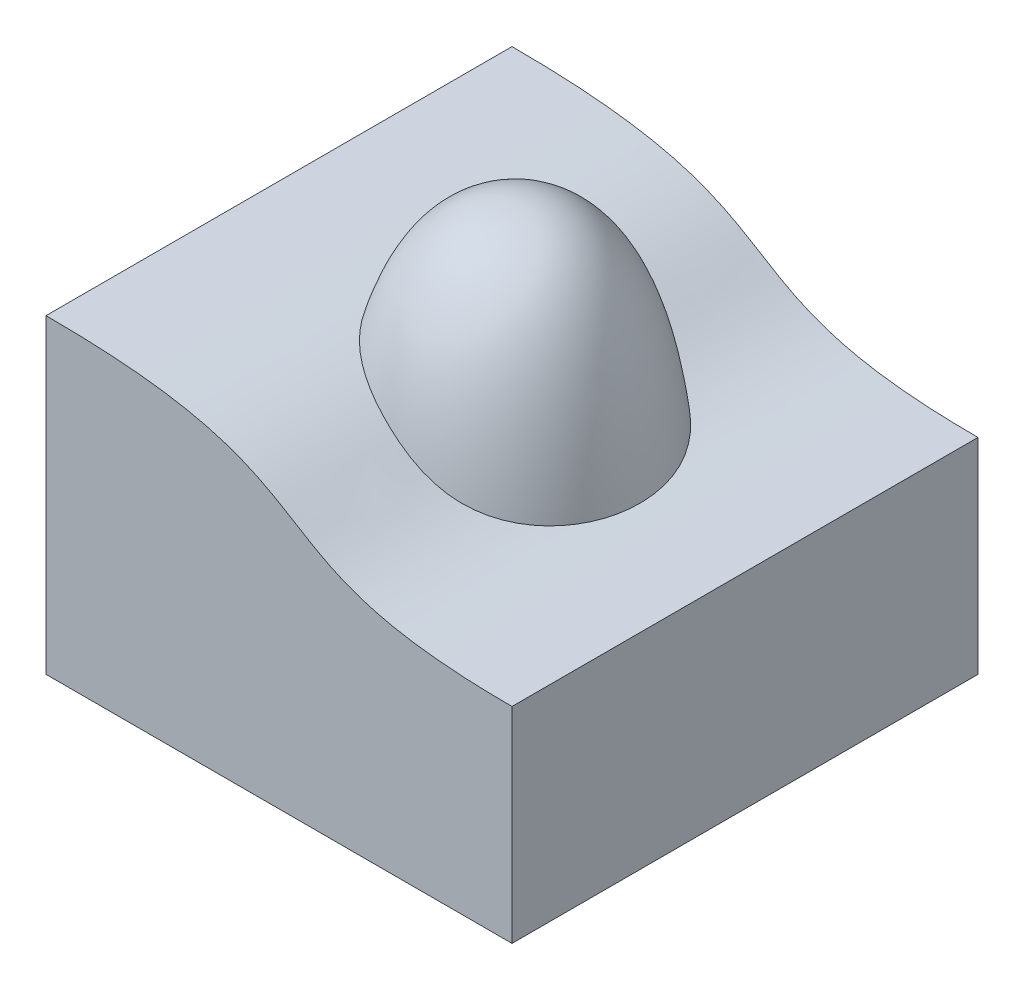
ISO-10303-21;
HEADER;
FILE_DESCRIPTION(('STEP AP214'),'2;1');
FILE_NAME('part.step','',(''),(''),'','','');
FILE_SCHEMA(('AUTOMOTIVE_DESIGN { 1 0 10303 214 1 1 1 1 }'));
ENDSEC;
DATA;
#1=APPLICATION_CONTEXT('core data for automotive mechanical design processes');
#2=APPLICATION_PROTOCOL_DEFINITION('international standard','automotive_design',2000,#1);
#3=PRODUCT_CONTEXT('',#1,'mechanical');
#4=PRODUCT('Part','Part','',(#3));
#5=PRODUCT_RELATED_PRODUCT_CATEGORY('part','',(#4));
#6=PRODUCT_DEFINITION_FORMATION('','',#4);
#7=PRODUCT_DEFINITION_CONTEXT('part definition',#1,'design');
#8=PRODUCT_DEFINITION('design','',#6,#7);
#9=PRODUCT_DEFINITION_SHAPE('','',#8);
#10=(LENGTH_UNIT() NAMED_UNIT(*) SI_UNIT(.MILLI.,.METRE.));
#11=(NAMED_UNIT(*) PLANE_ANGLE_UNIT() SI_UNIT($,.RADIAN.));
#12=(NAMED_UNIT(*) SI_UNIT($,.STERADIAN.) SOLID_ANGLE_UNIT());
#13=UNCERTAINTY_MEASURE_WITH_UNIT(LENGTH_MEASURE(1.E-05),#10,'distance_accuracy_value','');
#14=(GEOMETRIC_REPRESENTATION_CONTEXT(3) GLOBAL_UNCERTAINTY_ASSIGNED_CONTEXT((#13)) GLOBAL_UNIT_ASSIGNED_CONTEXT((#10,
#11,#12)) REPRESENTATION_CONTEXT('',''));
#15=CARTESIAN_POINT('',(0.,0.,0.));
#16=DIRECTION('',(0.,0.,1.));
#17=DIRECTION('',(1.,0.,0.));
#18=AXIS2_PLACEMENT_3D('',#15,#16,#17);
#19=CARTESIAN_POINT('',(0.,0.,-38.1));
#20=DIRECTION('',(-1.,0.,0.));
#21=DIRECTION('',(0.,0.,1.));
#22=AXIS2_PLACEMENT_3D('',#19,#20,#21);
#23=PLANE('',#22);
#24=DIRECTION('',(0.,0.,1.));
#25=VECTOR('',#24,1.);
#26=CARTESIAN_POINT('',(0.,0.,-38.1));
#27=LINE('',#26,#25);
#28=CARTESIAN_POINT('',(0.,0.,-38.1));
#29=VERTEX_POINT('',#28);
#30=CARTESIAN_POINT('',(0.,0.,38.1));
#31=VERTEX_POINT('',#30);
#32=EDGE_CURVE('E60',#29,#31,#27,.T.);
#33=ORIENTED_EDGE('',*,*,#32,.T.);
#34=DIRECTION('',(0.,-1.,0.));
#35=VECTOR('',#34,1.);
#36=CARTESIAN_POINT('',(0.,0.,38.1));
#37=LINE('',#36,#35);
#38=CARTESIAN_POINT('',(0.,50.8,38.1));
#39=VERTEX_POINT('',#38);
#40=EDGE_CURVE('E107',#39,#31,#37,.T.);
#41=ORIENTED_EDGE('',*,*,#40,.F.);
#42=DIRECTION('',(0.,0.,1.));
#43=VECTOR('',#42,1.);
#44=CARTESIAN_POINT('',(0.,50.8,-38.1));
#45=LINE('',#44,#43);
#46=CARTESIAN_POINT('',(0.,50.8,-38.1));
#47=VERTEX_POINT('',#46);
#48=EDGE_CURVE('E11',#47,#39,#45,.T.);
#49=ORIENTED_EDGE('',*,*,#48,.F.);
#50=DIRECTION('',(0.,-1.,0.));
#51=VECTOR('',#50,1.);
#52=CARTESIAN_POINT('',(0.,0.,-38.1));
#53=LINE('',#52,#51);
#54=EDGE_CURVE('E116',#47,#29,#53,.T.);
#55=ORIENTED_EDGE('',*,*,#54,.T.);
#56=EDGE_LOOP('',(#33,#41,#49,#55));
#57=FACE_BOUND('',#56,.T.);
#58=ADVANCED_FACE('F33',(#57),#23,.T.);
#59=CARTESIAN_POINT('',(76.2,0.,-38.1));
#60=DIRECTION('',(1.,0.,0.));
#61=DIRECTION('',(0.,0.,-1.));
#62=AXIS2_PLACEMENT_3D('',#59,#60,#61);
#63=PLANE('',#62);
#64=DIRECTION('',(0.,0.,1.));
#65=VECTOR('',#64,1.);
#66=CARTESIAN_POINT('',(76.2,33.5547167353857,-38.1));
#67=LINE('',#66,#65);
#68=CARTESIAN_POINT('',(76.2,33.5547167353857,-38.1));
#69=VERTEX_POINT('',#68);
#70=CARTESIAN_POINT('',(76.2,33.5547167353857,38.1));
#71=VERTEX_POINT('',#70);
#72=EDGE_CURVE('E94',#69,#71,#67,.T.);
#73=ORIENTED_EDGE('',*,*,#72,.T.);
#74=DIRECTION('',(0.,1.,0.));
#75=VECTOR('',#74,1.);
#76=CARTESIAN_POINT('',(76.2,0.,38.1));
#77=LINE('',#76,#75);
#78=CARTESIAN_POINT('',(76.2,0.,38.1));
#79=VERTEX_POINT('',#78);
#80=EDGE_CURVE('E113',#79,#71,#77,.T.);
#81=ORIENTED_EDGE('',*,*,#80,.F.);
#82=DIRECTION('',(0.,0.,1.));
#83=VECTOR('',#82,1.);
#84=CARTESIAN_POINT('',(76.2,0.,-38.1));
#85=LINE('',#84,#83);
#86=CARTESIAN_POINT('',(76.2,0.,-38.1));
#87=VERTEX_POINT('',#86);
#88=EDGE_CURVE('E45',#87,#79,#85,.T.);
#89=ORIENTED_EDGE('',*,*,#88,.F.);
#90=DIRECTION('',(0.,1.,0.));
#91=VECTOR('',#90,1.);
#92=CARTESIAN_POINT('',(76.2,0.,-38.1));
#93=LINE('',#92,#91);
#94=EDGE_CURVE('E121',#87,#69,#93,.T.);
#95=ORIENTED_EDGE('',*,*,#94,.T.);
#96=EDGE_LOOP('',(#73,#81,#89,#95));
#97=FACE_BOUND('',#96,.T.);
#98=ADVANCED_FACE('F130',(#97),#63,.T.);
#99=CARTESIAN_POINT('',(0.,0.,-38.1));
#100=DIRECTION('',(0.,-1.,0.));
#101=DIRECTION('',(0.,0.,-1.));
#102=AXIS2_PLACEMENT_3D('',#99,#100,#101);
#103=PLANE('',#102);
#104=ORIENTED_EDGE('',*,*,#88,.T.);
#105=DIRECTION('',(1.,0.,0.));
#106=VECTOR('',#105,1.);
#107=CARTESIAN_POINT('',(0.,0.,38.1));
#108=LINE('',#107,#106);
#109=EDGE_CURVE('E110',#31,#79,#108,.T.);
#110=ORIENTED_EDGE('',*,*,#109,.F.);
#111=ORIENTED_EDGE('',*,*,#32,.F.);
#112=DIRECTION('',(1.,0.,0.));
#113=VECTOR('',#112,1.);
#114=CARTESIAN_POINT('',(0.,0.,-38.1));
#115=LINE('',#114,#113);
#116=EDGE_CURVE('E119',#29,#87,#115,.T.);
#117=ORIENTED_EDGE('',*,*,#116,.T.);
#118=EDGE_LOOP('',(#104,#110,#111,#117));
#119=FACE_BOUND('',#118,.T.);
#120=ADVANCED_FACE('F127',(#119),#103,.T.);
#121=CARTESIAN_POINT('',(0.,0.,-38.1));
#122=DIRECTION('',(0.,0.,-1.));
#123=DIRECTION('',(-1.,0.,0.));
#124=AXIS2_PLACEMENT_3D('',#121,#122,#123);
#125=PLANE('',#124);
#126=CARTESIAN_POINT('',(0.,50.8,-38.1));
#127=CARTESIAN_POINT('',(50.619099791457,50.8,-38.1));
#128=CARTESIAN_POINT('',(30.9635515190279,33.5547167353857,-38.1));
#129=CARTESIAN_POINT('',(76.2,33.5547167353857,-38.1));
#130=B_SPLINE_CURVE_WITH_KNOTS('',3,(#126,#127,#128,#129),.UNSPECIFIED.,.F.,.F.,(4,4),(0.,1.),.UNSPECIFIED.);
#131=EDGE_CURVE('E88',#47,#69,#130,.T.);
#132=ORIENTED_EDGE('',*,*,#131,.T.);
#133=ORIENTED_EDGE('',*,*,#94,.F.);
#134=ORIENTED_EDGE('',*,*,#116,.F.);
#135=ORIENTED_EDGE('',*,*,#54,.F.);
#136=EDGE_LOOP('',(#132,#133,#134,#135));
#137=FACE_BOUND('',#136,.T.);
#138=ADVANCED_FACE('F132',(#137),#125,.T.);
#139=CARTESIAN_POINT('',(0.,0.,38.1));
#140=DIRECTION('',(0.,0.,-1.));
#141=DIRECTION('',(-1.,0.,0.));
#142=AXIS2_PLACEMENT_3D('',#139,#140,#141);
#143=PLANE('',#142);
#144=ORIENTED_EDGE('',*,*,#80,.T.);
#145=CARTESIAN_POINT('',(0.,50.8,38.1));
#146=CARTESIAN_POINT('',(50.619099791457,50.8,38.1));
#147=CARTESIAN_POINT('',(30.9635515190279,33.5547167353857,38.1));
#148=CARTESIAN_POINT('',(76.2,33.5547167353857,38.1));
#149=B_SPLINE_CURVE_WITH_KNOTS('',3,(#145,#146,#147,#148),.UNSPECIFIED.,.F.,.F.,(4,4),(0.,1.),.UNSPECIFIED.);
#150=EDGE_CURVE('E87',#39,#71,#149,.T.);
#151=ORIENTED_EDGE('',*,*,#150,.F.);
#152=ORIENTED_EDGE('',*,*,#40,.T.);
#153=ORIENTED_EDGE('',*,*,#109,.T.);
#154=EDGE_LOOP('',(#144,#151,#152,#153));
#155=FACE_BOUND('',#154,.T.);
#156=ADVANCED_FACE('F129',(#155),#143,.F.);
#157=DIRECTION('',(0.,0.,1.));
#158=VECTOR('',#157,1.);
#159=SURFACE_OF_LINEAR_EXTRUSION('',#130,#158);
#160=CARTESIAN_POINT('',(20.9222191028585,49.3873076605273,0.));
#161=CARTESIAN_POINT('',(20.9222182939661,49.3873075260688,-0.517357441442868));
#162=CARTESIAN_POINT('',(20.9438596526293,49.3837208506142,-1.03470270384581));
#163=CARTESIAN_POINT('',(21.0302244985484,49.3692895910036,-2.06567037946029));
#164=CARTESIAN_POINT('',(21.0949465399346,49.3584452504286,-2.57929291702874));
#165=CARTESIAN_POINT('',(21.2668706308326,49.3292474404458,-3.59908645866796));
#166=CARTESIAN_POINT('',(21.3740669709865,49.3108949802621,-4.1052584547536));
#167=CARTESIAN_POINT('',(21.6299626461721,49.266257754761,-5.10664438918645));
#168=CARTESIAN_POINT('',(21.7786623401835,49.2399729208329,-5.60185823271206));
#169=CARTESIAN_POINT('',(22.1161210875013,49.1788931841673,-6.57762091518543));
#170=CARTESIAN_POINT('',(22.3048601860618,49.144102519234,-7.05817692331934));
#171=CARTESIAN_POINT('',(22.7207118848375,49.06524262605,-8.00158951264453));
#172=CARTESIAN_POINT('',(22.947824308271,49.0211734405442,-8.46444617536274));
#173=CARTESIAN_POINT('',(23.4383443995503,48.9228237495622,-9.36939486092538));
#174=CARTESIAN_POINT('',(23.701753638282,48.8685428020952,-9.81148598394937));
#175=CARTESIAN_POINT('',(24.2624212395379,48.7486755663694,-10.6720362190673));
#176=CARTESIAN_POINT('',(24.559679971638,48.6830891546711,-11.0904950730645));
#177=CARTESIAN_POINT('',(25.1895217892577,48.5383843057051,-11.9067140134748));
#178=CARTESIAN_POINT('',(25.5225299094711,48.4590941343334,-12.3041156641849));
#179=CARTESIAN_POINT('',(26.2172352124062,48.2861726391225,-13.0696344035998));
#180=CARTESIAN_POINT('',(26.5789325395942,48.1925412430649,-13.4377513448211));
#181=CARTESIAN_POINT('',(27.3275033484916,47.9893778222673,-14.1427496584762));
#182=CARTESIAN_POINT('',(27.7143796697611,47.8798440024117,-14.4796274974973));
#183=CARTESIAN_POINT('',(28.5094227853434,47.6432963304308,-15.120513689198));
#184=CARTESIAN_POINT('',(28.9175898749824,47.5162822357949,-15.4245215857558));
#185=CARTESIAN_POINT('',(29.761877891383,47.2397296543615,-16.0059207208403));
#186=CARTESIAN_POINT('',(30.1984482631989,47.0896947497294,-16.2824233289411));
#187=CARTESIAN_POINT('',(31.0851028567889,46.7682386908753,-16.79889397355));
#188=CARTESIAN_POINT('',(31.5351871337702,46.5968174492766,-17.0388618607815));
#189=CARTESIAN_POINT('',(32.4438789375532,46.231880405169,-17.4818617158483));
#190=CARTESIAN_POINT('',(32.9024783521322,46.0383848107299,-17.6849270315997));
#191=CARTESIAN_POINT('',(33.8243693796292,45.6290904668554,-18.0547026547755));
#192=CARTESIAN_POINT('',(34.2876610395352,45.4132914938744,-18.2214125977597));
#193=CARTESIAN_POINT('',(35.0718031645483,45.0306182554876,-18.473089049063));
#194=CARTESIAN_POINT('',(35.39239798983,44.8692511539127,-18.5673915495166));
#195=CARTESIAN_POINT('',(36.0332795839399,44.5372169841478,-18.7392705690901));
#196=CARTESIAN_POINT('',(36.3535663412038,44.3665495797208,-18.8168464829845));
#197=CARTESIAN_POINT('',(36.9932160105907,44.0170566125896,-18.9555258367056));
#198=CARTESIAN_POINT('',(37.3125789581332,43.8382313671933,-19.0166299165837));
#199=CARTESIAN_POINT('',(37.9512152580783,43.4732992809545,-19.1227467156766));
#200=CARTESIAN_POINT('',(38.2704849108557,43.2871705646678,-19.1677062253837));
#201=CARTESIAN_POINT('',(38.9079976692924,42.9099990158514,-19.2413311790441));
#202=CARTESIAN_POINT('',(39.2262407556207,42.718956091384,-19.2699963179219));
#203=CARTESIAN_POINT('',(39.8621465052634,42.3340055185731,-19.3109349818187));
#204=CARTESIAN_POINT('',(40.1798090044385,42.1400971691979,-19.3232044261543));
#205=CARTESIAN_POINT('',(40.8721682981834,41.7167967175581,-19.3317420234539));
#206=CARTESIAN_POINT('',(41.2468453058347,41.4872963952464,-19.3247346609311));
#207=CARTESIAN_POINT('',(41.9968946948507,41.0314432566882,-19.2866138654881));
#208=CARTESIAN_POINT('',(42.3722670527618,40.8050903363962,-19.2555012313658));
#209=CARTESIAN_POINT('',(43.1242633874512,40.359301822194,-19.1680353896922));
#210=CARTESIAN_POINT('',(43.5008874464511,40.13986669304,-19.1116804901471));
#211=CARTESIAN_POINT('',(44.2536232445086,39.7122399125851,-18.9728030629239));
#212=CARTESIAN_POINT('',(44.6297306085055,39.5040053268397,-18.8903902519799));
#213=CARTESIAN_POINT('',(45.3819947265246,39.1005625380992,-18.6982733656139));
#214=CARTESIAN_POINT('',(45.7581514789303,38.9053539819016,-18.58857003056));
#215=CARTESIAN_POINT('',(46.5086619922726,38.5299710467311,-18.3411832623488));
#216=CARTESIAN_POINT('',(46.8830162437459,38.3497923308164,-18.2035079403308));
#217=CARTESIAN_POINT('',(47.587233506198,38.0242078013977,-17.9163952625211));
#218=CARTESIAN_POINT('',(47.9175167221406,37.8771502489736,-17.7698549521853));
#219=CARTESIAN_POINT('',(48.5729781106663,37.5960576671982,-17.4544658116767));
#220=CARTESIAN_POINT('',(48.8981559343845,37.4620235245514,-17.2856154643598));
#221=CARTESIAN_POINT('',(49.5413973521286,37.2068439622689,-16.9260486829759));
#222=CARTESIAN_POINT('',(49.8594609407996,37.0856985523343,-16.735332232451));
#223=CARTESIAN_POINT('',(50.4870425224291,36.8556422156123,-16.3323780190326));
#224=CARTESIAN_POINT('',(50.7965456504675,36.7467516722007,-16.1201054857329));
#225=CARTESIAN_POINT('',(51.4046131120507,36.5407545596523,-15.6751659826372));
#226=CARTESIAN_POINT('',(51.7031775160976,36.4436479145568,-15.4424991443191));
#227=CARTESIAN_POINT('',(52.2876120729582,36.2604306344901,-14.9578315102795));
#228=CARTESIAN_POINT('',(52.5734840676761,36.1743184006015,-14.7058335344385));
#229=CARTESIAN_POINT('',(53.2047731808583,35.9907769939688,-14.1145116552887));
#230=CARTESIAN_POINT('',(53.5459601341696,35.896371519794,-13.7697099473574));
#231=CARTESIAN_POINT('',(54.2028522931531,35.722017610461,-13.0533865084511));
#232=CARTESIAN_POINT('',(54.5185613606583,35.6420669820094,-12.6818688431759));
#233=CARTESIAN_POINT('',(55.1220544704486,35.4950027001545,-11.9148087872841));
#234=CARTESIAN_POINT('',(55.4098559158301,35.427881020969,-11.519281622434));
#235=CARTESIAN_POINT('',(55.9557839193152,35.3049287323126,-10.7065657893279));
#236=CARTESIAN_POINT('',(56.2139082144166,35.2490989836508,-10.289375472686));
#237=CARTESIAN_POINT('',(56.7147784464456,35.1440802537162,-9.40784261620111));
#238=CARTESIAN_POINT('',(56.955389461708,35.0955714995735,-8.94220460294493));
#239=CARTESIAN_POINT('',(57.3992858829112,35.0085693019359,-7.99256730250772));
#240=CARTESIAN_POINT('',(57.6025701847995,34.9700761546694,-7.50856747273014));
#241=CARTESIAN_POINT('',(57.9705122780482,34.901999025931,-6.52531786417892));
#242=CARTESIAN_POINT('',(58.1351575366493,34.8724179342466,-6.02606319660598));
#243=CARTESIAN_POINT('',(58.4246729471094,34.8213191074659,-5.01574956264515));
#244=CARTESIAN_POINT('',(58.5495423433867,34.7998015255425,-4.50469037221649));
#245=CARTESIAN_POINT('',(58.7631950610592,34.7634279270835,-3.45200566636862));
#246=CARTESIAN_POINT('',(58.8502047924491,34.7488965087137,-2.9100081938559));
#247=CARTESIAN_POINT('',(58.9795212847852,34.7274315501666,-1.8205495471666));
#248=CARTESIAN_POINT('',(59.0218267069587,34.7204982375318,-1.27308820985769));
#249=CARTESIAN_POINT('',(59.0614519710883,34.7140016134033,-0.176439539810936));
#250=CARTESIAN_POINT('',(59.0587672756952,34.7144390452649,0.372747961429895));
#251=CARTESIAN_POINT('',(59.0084190069862,34.7227002023714,1.46900086342402));
#252=CARTESIAN_POINT('',(58.9607553575005,34.7305239401247,2.01606626058207));
#253=CARTESIAN_POINT('',(58.8197768901509,34.7539795592393,3.11198148430235));
#254=CARTESIAN_POINT('',(58.7258269835503,34.7697201312474,3.6607474370512));
#255=CARTESIAN_POINT('',(58.492644860072,34.8095907519984,4.74827352293264));
#256=CARTESIAN_POINT('',(58.3534119893282,34.8337209218838,5.28703351146472));
#257=CARTESIAN_POINT('',(58.0306475087174,34.8911707042522,6.35062965390077));
#258=CARTESIAN_POINT('',(57.8471152882116,34.9244904434086,6.87546561576002));
#259=CARTESIAN_POINT('',(57.4370904900731,35.0014015294182,7.90730595176614));
#260=CARTESIAN_POINT('',(57.2105983805696,35.0449927643453,8.41431052014837));
#261=CARTESIAN_POINT('',(56.7182671045172,35.1434461680654,9.40281606388977));
#262=CARTESIAN_POINT('',(56.4527434835688,35.1982192046489,9.88448300297454));
#263=CARTESIAN_POINT('',(55.8831584818673,35.3208839354682,10.8227305361091));
#264=CARTESIAN_POINT('',(55.5790969574128,35.3887756786218,11.2793110366067));
#265=CARTESIAN_POINT('',(54.9349166848334,35.5396311413847,12.1637847029822));
#266=CARTESIAN_POINT('',(54.5947916936892,35.6225974723659,12.591672880877));
#267=CARTESIAN_POINT('',(53.8815905595682,35.8058023627774,13.4150802378184));
#268=CARTESIAN_POINT('',(53.5085156363511,35.9060402829685,13.8106006140315));
#269=CARTESIAN_POINT('',(52.7469875243433,36.1222394535965,14.5522829211767));
#270=CARTESIAN_POINT('',(52.3595673893632,36.2375069665542,14.8997071449236));
#271=CARTESIAN_POINT('',(51.5613532717083,36.4885085502221,15.5584235606169));
#272=CARTESIAN_POINT('',(51.1505600569557,36.6242419487675,15.8697169386214));
#273=CARTESIAN_POINT('',(50.3106685831337,36.917947843795,16.4531962514418));
#274=CARTESIAN_POINT('',(49.8816048158905,37.0758796268744,16.7254519775678));
#275=CARTESIAN_POINT('',(49.2275929623885,37.3305677684855,17.1034700443581));
#276=CARTESIAN_POINT('',(49.0078267228437,37.4184401867114,17.224427489213));
#277=CARTESIAN_POINT('',(48.565407528753,37.6002097499601,17.4560884057655));
#278=CARTESIAN_POINT('',(48.3427548119526,37.6941064012795,17.5667927159249));
#279=CARTESIAN_POINT('',(47.8409169907692,37.9114465725383,17.8034174630477));
#280=CARTESIAN_POINT('',(47.5611117169358,38.036534877027,17.9265210234976));
#281=CARTESIAN_POINT('',(46.9991613701216,38.2958656690843,18.1566348800208));
#282=CARTESIAN_POINT('',(46.7170163715909,38.4301078663501,18.2636456861083));
#283=CARTESIAN_POINT('',(46.1514389688332,38.7073105447457,18.4616514273735));
#284=CARTESIAN_POINT('',(45.8680066953883,38.8502701577811,18.5526479537832));
#285=CARTESIAN_POINT('',(45.3000454841595,39.1445557104575,18.7190620250937));
#286=CARTESIAN_POINT('',(45.0155155224372,39.2959001001582,18.7944433321538));
#287=CARTESIAN_POINT('',(44.4466316211027,39.6056892309824,18.9297396736405));
#288=CARTESIAN_POINT('',(44.1622776949589,39.7641344602642,18.9896536428208));
#289=CARTESIAN_POINT('',(43.594126503121,40.0868964494098,19.0944805635559));
#290=CARTESIAN_POINT('',(43.3103292959128,40.2512137946162,19.1393920149907));
#291=CARTESIAN_POINT('',(42.6364620777384,40.6471385364624,19.2289378343592));
#292=CARTESIAN_POINT('',(42.2466939802263,40.8807437575305,19.2670747166842));
#293=CARTESIAN_POINT('',(41.4679919727251,41.3522727314609,19.3171653780065));
#294=CARTESIAN_POINT('',(41.0790583590498,41.5901978016238,19.3291110302635));
#295=CARTESIAN_POINT('',(40.301049945205,42.0660268462376,19.3278265664735));
#296=CARTESIAN_POINT('',(39.9119751417959,42.3039307863046,19.3145879296973));
#297=CARTESIAN_POINT('',(39.1330269090521,42.775289571566,19.2635249664849));
#298=CARTESIAN_POINT('',(38.7431540295362,43.0087467674349,19.2257140231099));
#299=CARTESIAN_POINT('',(37.9618932914295,43.46748324513,19.1256736664621));
#300=CARTESIAN_POINT('',(37.5705059847787,43.6927652433765,19.0634524468194));
#301=CARTESIAN_POINT('',(36.7861752839969,44.1320479462109,18.9143642847126));
#302=CARTESIAN_POINT('',(36.3932323388624,44.3460516823503,18.8275040056085));
#303=CARTESIAN_POINT('',(35.7552839646205,44.6821239639771,18.6662743050671));
#304=CARTESIAN_POINT('',(35.5105064069016,44.8083648999081,18.5995953506511));
#305=CARTESIAN_POINT('',(35.0209660653401,45.0552105605538,18.4563965947127));
#306=CARTESIAN_POINT('',(34.776203282071,45.175815133754,18.3798765288525));
#307=CARTESIAN_POINT('',(34.2871494987116,45.4110774746147,18.2168819975224));
#308=CARTESIAN_POINT('',(34.0428584679358,45.5257356425317,18.1304082033094));
#309=CARTESIAN_POINT('',(33.5552467765311,45.7489399541046,17.9474026410604));
#310=CARTESIAN_POINT('',(33.3119261959246,45.8574856030295,17.8508700606903));
#311=CARTESIAN_POINT('',(32.5846344576805,46.1736437516404,17.5461986318115));
#312=CARTESIAN_POINT('',(32.1028778773554,46.3719959914885,17.3228353376735));
#313=CARTESIAN_POINT('',(31.1506710371479,46.7441423461982,16.8353736102666));
#314=CARTESIAN_POINT('',(30.6802210086383,46.9179359588563,16.5712743442119));
#315=CARTESIAN_POINT('',(29.7546943180911,47.2426875162079,16.0019637415838));
#316=CARTESIAN_POINT('',(29.299662249678,47.3935829944063,15.6966440903789));
#317=CARTESIAN_POINT('',(28.4116637573389,47.6737392668797,15.0465171232917));
#318=CARTESIAN_POINT('',(27.9786976698587,47.8029997313485,14.7017092055812));
#319=CARTESIAN_POINT('',(27.1397590549542,48.0419230643802,13.9741780377889));
#320=CARTESIAN_POINT('',(26.7337968464841,48.151578467998,13.5914404312133));
#321=CARTESIAN_POINT('',(25.9537753937989,48.3532370938397,12.7904584847002));
#322=CARTESIAN_POINT('',(25.5797148823688,48.445241017406,12.372215556441));
#323=CARTESIAN_POINT('',(24.8847357498504,48.6094897267499,11.5237542117001));
#324=CARTESIAN_POINT('',(24.5621348589817,48.6824667437804,11.0950541969885));
#325=CARTESIAN_POINT('',(23.9530585139647,48.815622541368,10.2108466690201));
#326=CARTESIAN_POINT('',(23.666581748262,48.8758017866268,9.75534012990592));
#327=CARTESIAN_POINT('',(23.1327124461853,48.9846615277044,8.82077986717306));
#328=CARTESIAN_POINT('',(22.8853120554629,49.0333443352827,8.34173090102623));
#329=CARTESIAN_POINT('',(22.4320174594661,49.1203407041891,7.36346581362425));
#330=CARTESIAN_POINT('',(22.2261235302496,49.1586541965518,6.86424955826383));
#331=CARTESIAN_POINT('',(21.8578709806098,49.2258307262363,5.8492682934976));
#332=CARTESIAN_POINT('',(21.6955215563267,49.2546917675843,5.33349981414702));
#333=CARTESIAN_POINT('',(21.4160380536407,49.3036619595707,4.28943966707125));
#334=CARTESIAN_POINT('',(21.298904269417,49.3237710532679,3.76114791789167));
#335=CARTESIAN_POINT('',(21.1110271563104,49.3557422133825,2.69615986893649));
#336=CARTESIAN_POINT('',(21.0402814444754,49.3676047034294,2.15946400233022));
#337=CARTESIAN_POINT('',(20.9458786543012,49.3833873600489,1.08184088810516));
#338=CARTESIAN_POINT('',(20.9222199485814,49.3873078011079,0.540913787371342));
#339=CARTESIAN_POINT('',(20.9222191028585,49.3873076605273,0.));
#340=B_SPLINE_CURVE_WITH_KNOTS('',3,(#160,#161,#162,#163,#164,#165,#166,#167,#168,#169,#170,
#171,#172,#173,#174,#175,#176,#177,#178,#179,#180,#181,#182,#183,#184,#185,#186,#187,#188,#189,
#190,#191,#192,#193,#194,#195,#196,#197,#198,#199,#200,#201,#202,#203,#204,#205,#206,#207,#208,
#209,#210,#211,#212,#213,#214,#215,#216,#217,#218,#219,#220,#221,#222,#223,#224,#225,#226,#227,
#228,#229,#230,#231,#232,#233,#234,#235,#236,#237,#238,#239,#240,#241,#242,#243,#244,#245,#246,
#247,#248,#249,#250,#251,#252,#253,#254,#255,#256,#257,#258,#259,#260,#261,#262,#263,#264,#265,
#266,#267,#268,#269,#270,#271,#272,#273,#274,#275,#276,#277,#278,#279,#280,#281,#282,#283,#284,
#285,#286,#287,#288,#289,#290,#291,#292,#293,#294,#295,#296,#297,#298,#299,#300,#301,#302,#303,
#304,#305,#306,#307,#308,#309,#310,#311,#312,#313,#314,#315,#316,#317,#318,#319,#320,#321,#322,
#323,#324,#325,#326,#327,#328,#329,#330,#331,#332,#333,#334,#335,#336,#337,#338,#339),
.UNSPECIFIED.,.T.,.F.,(4,2,2,2,2,2,2,2,2,2,2,2,2,2,2,2,2,2,2,2,2,2,2,2,2,2,2,2,2,2,2,2,2,2,2,2,
2,2,2,2,2,2,2,2,2,2,2,2,2,2,2,2,2,2,2,2,2,2,2,2,2,2,2,2,2,2,2,2,2,2,2,2,2,2,2,2,2,2,2,2,2,2,2,2,
2,2,2,2,2,4),(0.,1.5515875545185,3.10312303743532,4.65445003502791,6.20579045110914,
7.75635952249804,9.30692145077721,10.8575505067412,12.40819649442,13.9799087540819,
15.5516289286948,17.1235266621677,18.695446205379,20.3079049529185,21.9203702885935,
23.5313711547036,25.1423881693605,26.2552158272804,27.3680837443772,28.4809084121621,
29.5973677907969,30.7138480719385,31.8306061793445,33.1482578429092,34.465865844142,
35.7835621781114,37.0957826266517,38.4079674796735,39.7197723753276,40.8892427700451,
42.0587927329517,43.2283435761541,44.3998118337634,45.5712725397124,46.7425626855822,
48.2234056152878,49.7040236616717,51.1837123805955,52.6635138570105,54.2408493205366,
55.8182314311056,57.396124468184,58.9740474771078,60.6195179118862,62.2650376226325,
63.910723288541,65.5564117413445,67.2253372092703,68.8942867768201,70.5632593511128,
72.232213739842,73.8883505138879,75.5444934635723,77.2009235810367,78.8572924054934,
80.4541916425011,82.0510384436711,83.6449938309773,84.4421576030701,85.2392561285385,
86.2295822885883,87.2198770564443,88.210073369698,89.2025424804241,90.1950799249614,
91.187716584837,92.5548622532263,93.9224320661144,95.2904646581764,96.6577527886878,
98.0245823631009,99.391042645471,100.240953520554,101.090887229491,101.94076365437,
102.790708767396,104.489022515185,106.18737098705,107.890272365479,109.593199700739,
111.29677407864,113.000280754765,114.62267649103,116.245013306194,117.867023615666,
119.489044712704,121.111408094245,122.733782030929,124.356072619847,125.978307139586),.UNSPECIFIED.);
#341=CARTESIAN_POINT('',(20.9222191028585,49.3873076605273,0.));
#342=VERTEX_POINT('',#341);
#343=EDGE_CURVE('E36',#342,#342,#340,.T.);
#344=ORIENTED_EDGE('',*,*,#343,.T.);
#345=EDGE_LOOP('',(#344));
#346=FACE_BOUND('',#345,.T.);
#347=ORIENTED_EDGE('',*,*,#150,.T.);
#348=ORIENTED_EDGE('',*,*,#72,.F.);
#349=ORIENTED_EDGE('',*,*,#131,.F.);
#350=ORIENTED_EDGE('',*,*,#48,.T.);
#351=EDGE_LOOP('',(#347,#348,#349,#350));
#352=FACE_BOUND('',#351,.T.);
#353=ADVANCED_FACE('F83',(#346,#352),#159,.F.);
#354=CARTESIAN_POINT('',(38.626183585019,66.9836867164405,0.));
#355=CARTESIAN_POINT('',(20.1895712285324,66.9836867164403,0.));
#356=CARTESIAN_POINT('',(17.7117397570344,28.9993659406156,0.));
#357=B_SPLINE_CURVE_WITH_KNOTS('',2,(#354,#355,#356),.UNSPECIFIED.,.F.,.F.,(3,3),(0.,1.),.UNSPECIFIED.);
#358=CARTESIAN_POINT('',(38.626183585019,75.6724078655664,0.));
#359=DIRECTION('',(0.,1.,0.));
#360=AXIS1_PLACEMENT('',#358,#359);
#361=SURFACE_OF_REVOLUTION('',#357,#360);
#362=CARTESIAN_POINT('',(38.626183585019,66.9836867164405,0.));
#363=VERTEX_POINT('',#362);
#364=VERTEX_LOOP('',#363);
#365=FACE_BOUND('',#364,.T.);
#366=ORIENTED_EDGE('',*,*,#343,.F.);
#367=EDGE_LOOP('',(#366));
#368=FACE_BOUND('',#367,.T.);
#369=ADVANCED_FACE('F80',(#365,#368),#361,.F.);
#370=CLOSED_SHELL('',(#58,#98,#120,#138,#156,#353,#369));
#371=MANIFOLD_SOLID_BREP('B2',#370);
#372=ADVANCED_BREP_SHAPE_REPRESENTATION('',(#18,#371),#14);
#373=SHAPE_DEFINITION_REPRESENTATION(#9,#372);
ENDSEC;
END-ISO-10303-21;
